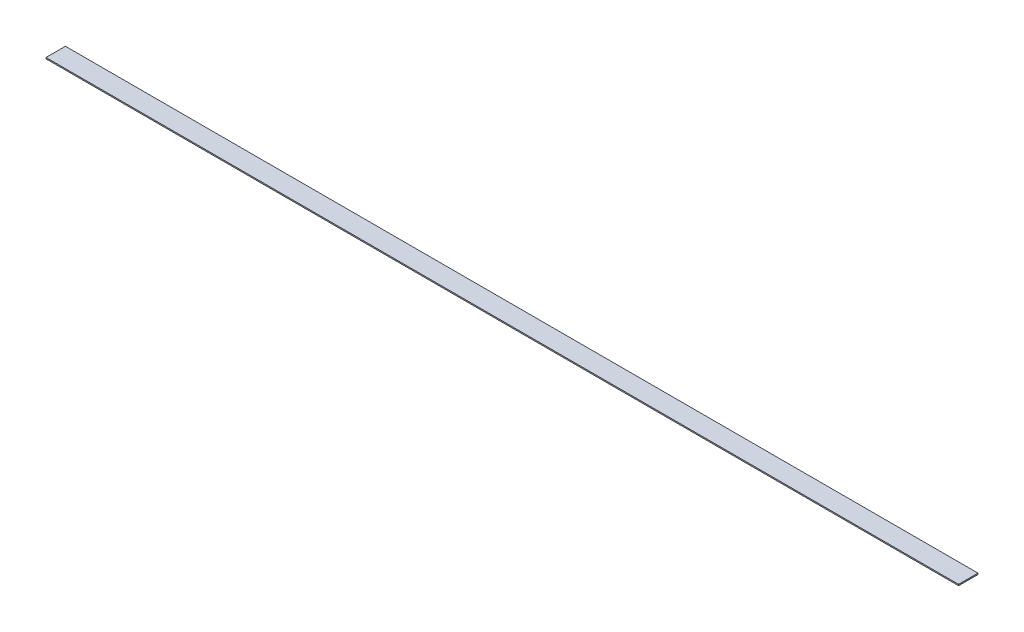
ISO-10303-21;
HEADER;
FILE_DESCRIPTION(('STEP AP214'),'2;1');
FILE_NAME('part.step','',(''),(''),'','','');
FILE_SCHEMA(('AUTOMOTIVE_DESIGN { 1 0 10303 214 1 1 1 1 }'));
ENDSEC;
DATA;
#1=APPLICATION_CONTEXT('core data for automotive mechanical design processes');
#2=APPLICATION_PROTOCOL_DEFINITION('international standard','automotive_design',2000,#1);
#3=PRODUCT_CONTEXT('',#1,'mechanical');
#4=PRODUCT('Part','Part','',(#3));
#5=PRODUCT_RELATED_PRODUCT_CATEGORY('part','',(#4));
#6=PRODUCT_DEFINITION_FORMATION('','',#4);
#7=PRODUCT_DEFINITION_CONTEXT('part definition',#1,'design');
#8=PRODUCT_DEFINITION('design','',#6,#7);
#9=PRODUCT_DEFINITION_SHAPE('','',#8);
#10=(LENGTH_UNIT() NAMED_UNIT(*) SI_UNIT(.MILLI.,.METRE.));
#11=(NAMED_UNIT(*) PLANE_ANGLE_UNIT() SI_UNIT($,.RADIAN.));
#12=(NAMED_UNIT(*) SI_UNIT($,.STERADIAN.) SOLID_ANGLE_UNIT());
#13=UNCERTAINTY_MEASURE_WITH_UNIT(LENGTH_MEASURE(1.E-05),#10,'distance_accuracy_value','');
#14=(GEOMETRIC_REPRESENTATION_CONTEXT(3) GLOBAL_UNCERTAINTY_ASSIGNED_CONTEXT((#13)) GLOBAL_UNIT_ASSIGNED_CONTEXT((#10,
#11,#12)) REPRESENTATION_CONTEXT('',''));
#15=CARTESIAN_POINT('',(0.,0.,0.));
#16=DIRECTION('',(0.,0.,1.));
#17=DIRECTION('',(1.,0.,0.));
#18=AXIS2_PLACEMENT_3D('',#15,#16,#17);
#19=CARTESIAN_POINT('',(596.900000000001,1.5875,-12.7));
#20=DIRECTION('',(-1.,0.,0.));
#21=DIRECTION('',(0.,0.,1.));
#22=AXIS2_PLACEMENT_3D('',#19,#20,#21);
#23=PLANE('',#22);
#24=DIRECTION('',(0.,0.,-1.));
#25=VECTOR('',#24,1.);
#26=CARTESIAN_POINT('',(596.900000000001,0.,-12.7));
#27=LINE('',#26,#25);
#28=CARTESIAN_POINT('',(596.900000000001,0.,12.7));
#29=VERTEX_POINT('',#28);
#30=CARTESIAN_POINT('',(596.900000000001,0.,-12.7));
#31=VERTEX_POINT('',#30);
#32=EDGE_CURVE('E98',#29,#31,#27,.T.);
#33=ORIENTED_EDGE('',*,*,#32,.T.);
#34=DIRECTION('',(0.,-1.,0.));
#35=VECTOR('',#34,1.);
#36=CARTESIAN_POINT('',(596.900000000001,1.5875,-12.7));
#37=LINE('',#36,#35);
#38=CARTESIAN_POINT('',(596.900000000001,1.5875,-12.7));
#39=VERTEX_POINT('',#38);
#40=EDGE_CURVE('E11',#39,#31,#37,.T.);
#41=ORIENTED_EDGE('',*,*,#40,.F.);
#42=DIRECTION('',(0.,0.,-1.));
#43=VECTOR('',#42,1.);
#44=CARTESIAN_POINT('',(596.900000000001,1.5875,-12.7));
#45=LINE('',#44,#43);
#46=CARTESIAN_POINT('',(596.900000000001,1.5875,12.7));
#47=VERTEX_POINT('',#46);
#48=EDGE_CURVE('E86',#47,#39,#45,.T.);
#49=ORIENTED_EDGE('',*,*,#48,.F.);
#50=DIRECTION('',(0.,-1.,0.));
#51=VECTOR('',#50,1.);
#52=CARTESIAN_POINT('',(596.900000000001,1.5875,12.7));
#53=LINE('',#52,#51);
#54=EDGE_CURVE('E94',#47,#29,#53,.T.);
#55=ORIENTED_EDGE('',*,*,#54,.T.);
#56=EDGE_LOOP('',(#33,#41,#49,#55));
#57=FACE_BOUND('',#56,.T.);
#58=ADVANCED_FACE('F35',(#57),#23,.F.);
#59=CARTESIAN_POINT('',(-596.899999999999,1.5875,-12.7));
#60=DIRECTION('',(0.,0.,1.));
#61=DIRECTION('',(1.,0.,0.));
#62=AXIS2_PLACEMENT_3D('',#59,#60,#61);
#63=PLANE('',#62);
#64=DIRECTION('',(-1.,0.,0.));
#65=VECTOR('',#64,1.);
#66=CARTESIAN_POINT('',(-596.899999999999,0.,-12.7));
#67=LINE('',#66,#65);
#68=CARTESIAN_POINT('',(-596.899999999999,0.,-12.7));
#69=VERTEX_POINT('',#68);
#70=EDGE_CURVE('E90',#31,#69,#67,.T.);
#71=ORIENTED_EDGE('',*,*,#70,.T.);
#72=DIRECTION('',(0.,-1.,0.));
#73=VECTOR('',#72,1.);
#74=CARTESIAN_POINT('',(-596.899999999999,1.5875,-12.7));
#75=LINE('',#74,#73);
#76=CARTESIAN_POINT('',(-596.899999999999,1.5875,-12.7));
#77=VERTEX_POINT('',#76);
#78=EDGE_CURVE('E43',#77,#69,#75,.T.);
#79=ORIENTED_EDGE('',*,*,#78,.F.);
#80=DIRECTION('',(-1.,0.,0.));
#81=VECTOR('',#80,1.);
#82=CARTESIAN_POINT('',(-596.899999999999,1.5875,-12.7));
#83=LINE('',#82,#81);
#84=EDGE_CURVE('E81',#39,#77,#83,.T.);
#85=ORIENTED_EDGE('',*,*,#84,.F.);
#86=ORIENTED_EDGE('',*,*,#40,.T.);
#87=EDGE_LOOP('',(#71,#79,#85,#86));
#88=FACE_BOUND('',#87,.T.);
#89=ADVANCED_FACE('F89',(#88),#63,.F.);
#90=CARTESIAN_POINT('',(-596.899999999999,1.5875,-12.7));
#91=DIRECTION('',(1.,0.,0.));
#92=DIRECTION('',(0.,0.,-1.));
#93=AXIS2_PLACEMENT_3D('',#90,#91,#92);
#94=PLANE('',#93);
#95=DIRECTION('',(0.,0.,1.));
#96=VECTOR('',#95,1.);
#97=CARTESIAN_POINT('',(-596.899999999999,0.,-12.7));
#98=LINE('',#97,#96);
#99=CARTESIAN_POINT('',(-596.899999999999,0.,12.7));
#100=VERTEX_POINT('',#99);
#101=EDGE_CURVE('E68',#69,#100,#98,.T.);
#102=ORIENTED_EDGE('',*,*,#101,.T.);
#103=DIRECTION('',(0.,-1.,0.));
#104=VECTOR('',#103,1.);
#105=CARTESIAN_POINT('',(-596.899999999999,1.5875,12.7));
#106=LINE('',#105,#104);
#107=CARTESIAN_POINT('',(-596.899999999999,1.5875,12.7));
#108=VERTEX_POINT('',#107);
#109=EDGE_CURVE('E91',#108,#100,#106,.T.);
#110=ORIENTED_EDGE('',*,*,#109,.F.);
#111=DIRECTION('',(0.,0.,1.));
#112=VECTOR('',#111,1.);
#113=CARTESIAN_POINT('',(-596.899999999999,1.5875,-12.7));
#114=LINE('',#113,#112);
#115=EDGE_CURVE('E84',#77,#108,#114,.T.);
#116=ORIENTED_EDGE('',*,*,#115,.F.);
#117=ORIENTED_EDGE('',*,*,#78,.T.);
#118=EDGE_LOOP('',(#102,#110,#116,#117));
#119=FACE_BOUND('',#118,.T.);
#120=ADVANCED_FACE('F92',(#119),#94,.F.);
#121=CARTESIAN_POINT('',(-596.899999999999,1.5875,12.7));
#122=DIRECTION('',(0.,0.,-1.));
#123=DIRECTION('',(-1.,0.,0.));
#124=AXIS2_PLACEMENT_3D('',#121,#122,#123);
#125=PLANE('',#124);
#126=DIRECTION('',(1.,0.,0.));
#127=VECTOR('',#126,1.);
#128=CARTESIAN_POINT('',(-596.899999999999,0.,12.7));
#129=LINE('',#128,#127);
#130=EDGE_CURVE('E74',#100,#29,#129,.T.);
#131=ORIENTED_EDGE('',*,*,#130,.T.);
#132=ORIENTED_EDGE('',*,*,#54,.F.);
#133=DIRECTION('',(1.,0.,0.));
#134=VECTOR('',#133,1.);
#135=CARTESIAN_POINT('',(-596.899999999999,1.5875,12.7));
#136=LINE('',#135,#134);
#137=EDGE_CURVE('E51',#108,#47,#136,.T.);
#138=ORIENTED_EDGE('',*,*,#137,.F.);
#139=ORIENTED_EDGE('',*,*,#109,.T.);
#140=EDGE_LOOP('',(#131,#132,#138,#139));
#141=FACE_BOUND('',#140,.T.);
#142=ADVANCED_FACE('F105',(#141),#125,.F.);
#143=CARTESIAN_POINT('',(0.,1.5875,0.));
#144=DIRECTION('',(0.,1.,0.));
#145=DIRECTION('',(0.,0.,1.));
#146=AXIS2_PLACEMENT_3D('',#143,#144,#145);
#147=PLANE('',#146);
#148=ORIENTED_EDGE('',*,*,#48,.T.);
#149=ORIENTED_EDGE('',*,*,#84,.T.);
#150=ORIENTED_EDGE('',*,*,#115,.T.);
#151=ORIENTED_EDGE('',*,*,#137,.T.);
#152=EDGE_LOOP('',(#148,#149,#150,#151));
#153=FACE_BOUND('',#152,.T.);
#154=ADVANCED_FACE('F82',(#153),#147,.T.);
#155=CARTESIAN_POINT('',(0.,0.,0.));
#156=DIRECTION('',(0.,1.,0.));
#157=DIRECTION('',(0.,0.,1.));
#158=AXIS2_PLACEMENT_3D('',#155,#156,#157);
#159=PLANE('',#158);
#160=ORIENTED_EDGE('',*,*,#32,.F.);
#161=ORIENTED_EDGE('',*,*,#130,.F.);
#162=ORIENTED_EDGE('',*,*,#101,.F.);
#163=ORIENTED_EDGE('',*,*,#70,.F.);
#164=EDGE_LOOP('',(#160,#161,#162,#163));
#165=FACE_BOUND('',#164,.T.);
#166=ADVANCED_FACE('F108',(#165),#159,.F.);
#167=CLOSED_SHELL('',(#58,#89,#120,#142,#154,#166));
#168=MANIFOLD_SOLID_BREP('B2',#167);
#169=ADVANCED_BREP_SHAPE_REPRESENTATION('',(#18,#168),#14);
#170=SHAPE_DEFINITION_REPRESENTATION(#9,#169);
ENDSEC;
END-ISO-10303-21;
